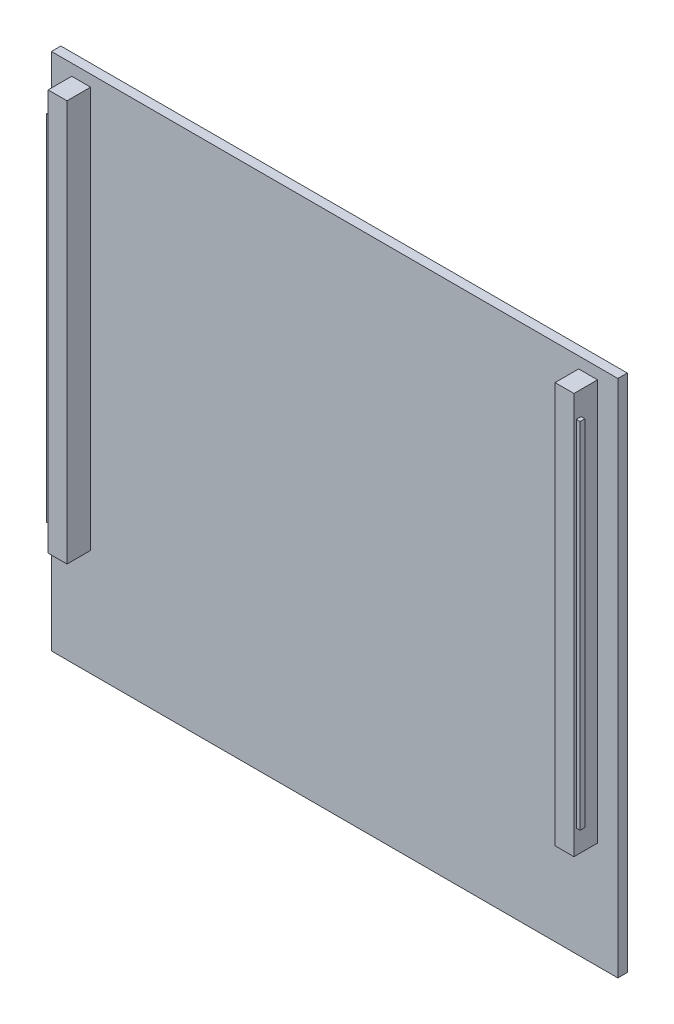
ISO-10303-21;
HEADER;
FILE_DESCRIPTION(('STEP AP214'),'2;1');
FILE_NAME('part.step','',(''),(''),'','','');
FILE_SCHEMA(('AUTOMOTIVE_DESIGN { 1 0 10303 214 1 1 1 1 }'));
ENDSEC;
DATA;
#1=APPLICATION_CONTEXT('core data for automotive mechanical design processes');
#2=APPLICATION_PROTOCOL_DEFINITION('international standard','automotive_design',2000,#1);
#3=PRODUCT_CONTEXT('',#1,'mechanical');
#4=PRODUCT('Part','Part','',(#3));
#5=PRODUCT_RELATED_PRODUCT_CATEGORY('part','',(#4));
#6=PRODUCT_DEFINITION_FORMATION('','',#4);
#7=PRODUCT_DEFINITION_CONTEXT('part definition',#1,'design');
#8=PRODUCT_DEFINITION('design','',#6,#7);
#9=PRODUCT_DEFINITION_SHAPE('','',#8);
#10=(LENGTH_UNIT() NAMED_UNIT(*) SI_UNIT(.MILLI.,.METRE.));
#11=(NAMED_UNIT(*) PLANE_ANGLE_UNIT() SI_UNIT($,.RADIAN.));
#12=(NAMED_UNIT(*) SI_UNIT($,.STERADIAN.) SOLID_ANGLE_UNIT());
#13=UNCERTAINTY_MEASURE_WITH_UNIT(LENGTH_MEASURE(1.E-05),#10,'distance_accuracy_value','');
#14=(GEOMETRIC_REPRESENTATION_CONTEXT(3) GLOBAL_UNCERTAINTY_ASSIGNED_CONTEXT((#13)) GLOBAL_UNIT_ASSIGNED_CONTEXT((#10,
#11,#12)) REPRESENTATION_CONTEXT('',''));
#15=CARTESIAN_POINT('',(0.,0.,0.));
#16=DIRECTION('',(0.,0.,1.));
#17=DIRECTION('',(1.,0.,0.));
#18=AXIS2_PLACEMENT_3D('',#15,#16,#17);
#19=CARTESIAN_POINT('',(-53.3338940566583,53.7305207646671,7.));
#20=DIRECTION('',(1.,0.,0.));
#21=DIRECTION('',(0.,1.,0.));
#22=AXIS2_PLACEMENT_3D('',#19,#20,#21);
#23=PLANE('',#22);
#24=DIRECTION('',(0.,-1.,0.));
#25=VECTOR('',#24,1.);
#26=CARTESIAN_POINT('',(-53.3338940566583,53.7305207646671,2.));
#27=LINE('',#26,#25);
#28=CARTESIAN_POINT('',(-53.3338940566583,53.7305207646671,2.));
#29=VERTEX_POINT('',#28);
#30=CARTESIAN_POINT('',(-53.3338940566583,-31.2694792353329,2.));
#31=VERTEX_POINT('',#30);
#32=EDGE_CURVE('E293',#29,#31,#27,.T.);
#33=ORIENTED_EDGE('',*,*,#32,.T.);
#34=DIRECTION('',(0.,0.,-1.));
#35=VECTOR('',#34,1.);
#36=CARTESIAN_POINT('',(-53.3338940566583,-31.2694792353329,7.));
#37=LINE('',#36,#35);
#38=CARTESIAN_POINT('',(-53.3338940566583,-31.2694792353329,7.));
#39=VERTEX_POINT('',#38);
#40=EDGE_CURVE('E331',#39,#31,#37,.T.);
#41=ORIENTED_EDGE('',*,*,#40,.F.);
#42=DIRECTION('',(0.,-1.,0.));
#43=VECTOR('',#42,1.);
#44=CARTESIAN_POINT('',(-53.3338940566583,53.7305207646671,7.));
#45=LINE('',#44,#43);
#46=CARTESIAN_POINT('',(-53.3338940566583,53.7305207646671,7.));
#47=VERTEX_POINT('',#46);
#48=EDGE_CURVE('E294',#47,#39,#45,.T.);
#49=ORIENTED_EDGE('',*,*,#48,.F.);
#50=DIRECTION('',(0.,0.,-1.));
#51=VECTOR('',#50,1.);
#52=CARTESIAN_POINT('',(-53.3338940566583,53.7305207646671,7.));
#53=LINE('',#52,#51);
#54=EDGE_CURVE('E308',#47,#29,#53,.T.);
#55=ORIENTED_EDGE('',*,*,#54,.T.);
#56=EDGE_LOOP('',(#33,#41,#49,#55));
#57=FACE_BOUND('',#56,.T.);
#58=DIRECTION('',(0.,-1.,0.));
#59=VECTOR('',#58,1.);
#60=CARTESIAN_POINT('',(-53.3338940566583,48.7305207646671,5.5));
#61=LINE('',#60,#59);
#62=CARTESIAN_POINT('',(-53.3338940566583,48.7305207646671,5.5));
#63=VERTEX_POINT('',#62);
#64=CARTESIAN_POINT('',(-53.3338940566583,-26.2694792353329,5.50000000000001));
#65=VERTEX_POINT('',#64);
#66=EDGE_CURVE('E199',#63,#65,#61,.T.);
#67=ORIENTED_EDGE('',*,*,#66,.F.);
#68=DIRECTION('',(0.,0.,-1.));
#69=VECTOR('',#68,1.);
#70=CARTESIAN_POINT('',(-53.3338940566583,48.7305207646671,5.5));
#71=LINE('',#70,#69);
#72=CARTESIAN_POINT('',(-53.3338940566583,48.7305207646671,6.5));
#73=VERTEX_POINT('',#72);
#74=EDGE_CURVE('E196',#73,#63,#71,.T.);
#75=ORIENTED_EDGE('',*,*,#74,.F.);
#76=DIRECTION('',(0.,1.,0.));
#77=VECTOR('',#76,1.);
#78=CARTESIAN_POINT('',(-53.3338940566583,48.7305207646671,6.5));
#79=LINE('',#78,#77);
#80=CARTESIAN_POINT('',(-53.3338940566583,-26.2694792353329,6.50000000000001));
#81=VERTEX_POINT('',#80);
#82=EDGE_CURVE('E60',#81,#73,#79,.T.);
#83=ORIENTED_EDGE('',*,*,#82,.F.);
#84=DIRECTION('',(0.,0.,1.));
#85=VECTOR('',#84,1.);
#86=CARTESIAN_POINT('',(-53.3338940566583,-26.2694792353329,5.50000000000001));
#87=LINE('',#86,#85);
#88=EDGE_CURVE('E55',#65,#81,#87,.T.);
#89=ORIENTED_EDGE('',*,*,#88,.F.);
#90=EDGE_LOOP('',(#67,#75,#83,#89));
#91=FACE_BOUND('',#90,.T.);
#92=ADVANCED_FACE('F39',(#57,#91),#23,.F.);
#93=CARTESIAN_POINT('',(58.0661059433417,53.7305207646671,7.));
#94=DIRECTION('',(-1.,0.,0.));
#95=DIRECTION('',(0.,-1.,0.));
#96=AXIS2_PLACEMENT_3D('',#93,#94,#95);
#97=PLANE('',#96);
#98=DIRECTION('',(0.,1.,0.));
#99=VECTOR('',#98,1.);
#100=CARTESIAN_POINT('',(58.0661059433417,53.7305207646671,2.));
#101=LINE('',#100,#99);
#102=CARTESIAN_POINT('',(58.0661059433417,-31.2694792353329,2.));
#103=VERTEX_POINT('',#102);
#104=CARTESIAN_POINT('',(58.0661059433417,53.7305207646671,2.));
#105=VERTEX_POINT('',#104);
#106=EDGE_CURVE('E252',#103,#105,#101,.T.);
#107=ORIENTED_EDGE('',*,*,#106,.T.);
#108=DIRECTION('',(0.,0.,-1.));
#109=VECTOR('',#108,1.);
#110=CARTESIAN_POINT('',(58.0661059433417,53.7305207646671,7.));
#111=LINE('',#110,#109);
#112=CARTESIAN_POINT('',(58.0661059433417,53.7305207646671,7.));
#113=VERTEX_POINT('',#112);
#114=EDGE_CURVE('E290',#113,#105,#111,.T.);
#115=ORIENTED_EDGE('',*,*,#114,.F.);
#116=DIRECTION('',(0.,1.,0.));
#117=VECTOR('',#116,1.);
#118=CARTESIAN_POINT('',(58.0661059433417,53.7305207646671,7.));
#119=LINE('',#118,#117);
#120=CARTESIAN_POINT('',(58.0661059433417,-31.2694792353329,7.));
#121=VERTEX_POINT('',#120);
#122=EDGE_CURVE('E253',#121,#113,#119,.T.);
#123=ORIENTED_EDGE('',*,*,#122,.F.);
#124=DIRECTION('',(0.,0.,-1.));
#125=VECTOR('',#124,1.);
#126=CARTESIAN_POINT('',(58.0661059433417,-31.2694792353329,7.));
#127=LINE('',#126,#125);
#128=EDGE_CURVE('E267',#121,#103,#127,.T.);
#129=ORIENTED_EDGE('',*,*,#128,.T.);
#130=EDGE_LOOP('',(#107,#115,#123,#129));
#131=FACE_BOUND('',#130,.T.);
#132=DIRECTION('',(0.,-1.,0.));
#133=VECTOR('',#132,1.);
#134=CARTESIAN_POINT('',(58.0661059433417,48.7305207646671,6.5));
#135=LINE('',#134,#133);
#136=CARTESIAN_POINT('',(58.0661059433417,48.7305207646671,6.5));
#137=VERTEX_POINT('',#136);
#138=CARTESIAN_POINT('',(58.0661059433417,-26.2694792353329,6.49999999999999));
#139=VERTEX_POINT('',#138);
#140=EDGE_CURVE('E201',#137,#139,#135,.T.);
#141=ORIENTED_EDGE('',*,*,#140,.F.);
#142=DIRECTION('',(0.,0.,1.));
#143=VECTOR('',#142,1.);
#144=CARTESIAN_POINT('',(58.0661059433417,48.7305207646671,6.5));
#145=LINE('',#144,#143);
#146=CARTESIAN_POINT('',(58.0661059433417,48.7305207646671,5.5));
#147=VERTEX_POINT('',#146);
#148=EDGE_CURVE('E217',#147,#137,#145,.T.);
#149=ORIENTED_EDGE('',*,*,#148,.F.);
#150=DIRECTION('',(0.,1.,0.));
#151=VECTOR('',#150,1.);
#152=CARTESIAN_POINT('',(58.0661059433417,48.7305207646671,5.5));
#153=LINE('',#152,#151);
#154=CARTESIAN_POINT('',(58.0661059433417,-26.2694792353329,5.49999999999999));
#155=VERTEX_POINT('',#154);
#156=EDGE_CURVE('E230',#155,#147,#153,.T.);
#157=ORIENTED_EDGE('',*,*,#156,.F.);
#158=DIRECTION('',(0.,0.,-1.));
#159=VECTOR('',#158,1.);
#160=CARTESIAN_POINT('',(58.0661059433417,-26.2694792353329,6.49999999999999));
#161=LINE('',#160,#159);
#162=EDGE_CURVE('E206',#139,#155,#161,.T.);
#163=ORIENTED_EDGE('',*,*,#162,.F.);
#164=EDGE_LOOP('',(#141,#149,#157,#163));
#165=FACE_BOUND('',#164,.T.);
#166=ADVANCED_FACE('F398',(#131,#165),#97,.F.);
#167=CARTESIAN_POINT('',(0.,0.,2.));
#168=DIRECTION('',(0.,0.,1.));
#169=DIRECTION('',(1.,0.,0.));
#170=AXIS2_PLACEMENT_3D('',#167,#168,#169);
#171=PLANE('',#170);
#172=DIRECTION('',(0.,-1.,0.));
#173=VECTOR('',#172,1.);
#174=CARTESIAN_POINT('',(-57.6338940566583,56.1305207646671,2.));
#175=LINE('',#174,#173);
#176=CARTESIAN_POINT('',(-57.6338940566583,56.1305207646671,2.));
#177=VERTEX_POINT('',#176);
#178=CARTESIAN_POINT('',(-57.6338940566583,-53.8694792353329,2.));
#179=VERTEX_POINT('',#178);
#180=EDGE_CURVE('E335',#177,#179,#175,.T.);
#181=ORIENTED_EDGE('',*,*,#180,.T.);
#182=DIRECTION('',(1.,0.,0.));
#183=VECTOR('',#182,1.);
#184=CARTESIAN_POINT('',(-57.6338940566583,-53.8694792353329,2.));
#185=LINE('',#184,#183);
#186=CARTESIAN_POINT('',(62.3661059433417,-53.8694792353329,2.));
#187=VERTEX_POINT('',#186);
#188=EDGE_CURVE('E339',#179,#187,#185,.T.);
#189=ORIENTED_EDGE('',*,*,#188,.T.);
#190=DIRECTION('',(0.,1.,0.));
#191=VECTOR('',#190,1.);
#192=CARTESIAN_POINT('',(62.3661059433417,56.1305207646671,2.));
#193=LINE('',#192,#191);
#194=CARTESIAN_POINT('',(62.3661059433417,56.1305207646671,2.));
#195=VERTEX_POINT('',#194);
#196=EDGE_CURVE('E343',#187,#195,#193,.T.);
#197=ORIENTED_EDGE('',*,*,#196,.T.);
#198=DIRECTION('',(-1.,0.,0.));
#199=VECTOR('',#198,1.);
#200=CARTESIAN_POINT('',(-57.6338940566583,56.1305207646671,2.));
#201=LINE('',#200,#199);
#202=EDGE_CURVE('E346',#195,#177,#201,.T.);
#203=ORIENTED_EDGE('',*,*,#202,.T.);
#204=EDGE_LOOP('',(#181,#189,#197,#203));
#205=FACE_BOUND('',#204,.T.);
#206=DIRECTION('',(1.,0.,0.));
#207=VECTOR('',#206,1.);
#208=CARTESIAN_POINT('',(-53.3338940566583,-31.2694792353329,2.));
#209=LINE('',#208,#207);
#210=CARTESIAN_POINT('',(-49.3338940566583,-31.2694792353329,2.));
#211=VERTEX_POINT('',#210);
#212=EDGE_CURVE('E312',#31,#211,#209,.T.);
#213=ORIENTED_EDGE('',*,*,#212,.F.);
#214=ORIENTED_EDGE('',*,*,#32,.F.);
#215=DIRECTION('',(-1.,0.,0.));
#216=VECTOR('',#215,1.);
#217=CARTESIAN_POINT('',(-53.3338940566583,53.7305207646671,2.));
#218=LINE('',#217,#216);
#219=CARTESIAN_POINT('',(-49.3338940566583,53.7305207646671,2.));
#220=VERTEX_POINT('',#219);
#221=EDGE_CURVE('E299',#220,#29,#218,.T.);
#222=ORIENTED_EDGE('',*,*,#221,.F.);
#223=DIRECTION('',(0.,1.,0.));
#224=VECTOR('',#223,1.);
#225=CARTESIAN_POINT('',(-49.3338940566583,53.7305207646671,2.));
#226=LINE('',#225,#224);
#227=EDGE_CURVE('E315',#211,#220,#226,.T.);
#228=ORIENTED_EDGE('',*,*,#227,.F.);
#229=EDGE_LOOP('',(#213,#214,#222,#228));
#230=FACE_BOUND('',#229,.T.);
#231=DIRECTION('',(-1.,0.,0.));
#232=VECTOR('',#231,1.);
#233=CARTESIAN_POINT('',(58.0661059433417,53.7305207646671,2.));
#234=LINE('',#233,#232);
#235=CARTESIAN_POINT('',(54.0661059433417,53.7305207646671,2.));
#236=VERTEX_POINT('',#235);
#237=EDGE_CURVE('E271',#105,#236,#234,.T.);
#238=ORIENTED_EDGE('',*,*,#237,.F.);
#239=ORIENTED_EDGE('',*,*,#106,.F.);
#240=DIRECTION('',(1.,0.,0.));
#241=VECTOR('',#240,1.);
#242=CARTESIAN_POINT('',(58.0661059433417,-31.2694792353329,2.));
#243=LINE('',#242,#241);
#244=CARTESIAN_POINT('',(54.0661059433417,-31.2694792353329,2.));
#245=VERTEX_POINT('',#244);
#246=EDGE_CURVE('E258',#245,#103,#243,.T.);
#247=ORIENTED_EDGE('',*,*,#246,.F.);
#248=DIRECTION('',(0.,-1.,0.));
#249=VECTOR('',#248,1.);
#250=CARTESIAN_POINT('',(54.0661059433417,53.7305207646671,2.));
#251=LINE('',#250,#249);
#252=EDGE_CURVE('E274',#236,#245,#251,.T.);
#253=ORIENTED_EDGE('',*,*,#252,.F.);
#254=EDGE_LOOP('',(#238,#239,#247,#253));
#255=FACE_BOUND('',#254,.T.);
#256=ADVANCED_FACE('F388',(#205,#230,#255),#171,.T.);
#257=CARTESIAN_POINT('',(-57.6338940566583,56.1305207646671,2.));
#258=DIRECTION('',(1.,0.,0.));
#259=DIRECTION('',(0.,1.,0.));
#260=AXIS2_PLACEMENT_3D('',#257,#258,#259);
#261=PLANE('',#260);
#262=DIRECTION('',(0.,-1.,0.));
#263=VECTOR('',#262,1.);
#264=CARTESIAN_POINT('',(-57.6338940566583,56.1305207646671,0.));
#265=LINE('',#264,#263);
#266=CARTESIAN_POINT('',(-57.6338940566583,56.1305207646671,0.));
#267=VERTEX_POINT('',#266);
#268=CARTESIAN_POINT('',(-57.6338940566583,-53.8694792353329,0.));
#269=VERTEX_POINT('',#268);
#270=EDGE_CURVE('E334',#267,#269,#265,.T.);
#271=ORIENTED_EDGE('',*,*,#270,.T.);
#272=DIRECTION('',(0.,0.,-1.));
#273=VECTOR('',#272,1.);
#274=CARTESIAN_POINT('',(-57.6338940566583,-53.8694792353329,2.));
#275=LINE('',#274,#273);
#276=EDGE_CURVE('E11',#179,#269,#275,.T.);
#277=ORIENTED_EDGE('',*,*,#276,.F.);
#278=ORIENTED_EDGE('',*,*,#180,.F.);
#279=DIRECTION('',(0.,0.,-1.));
#280=VECTOR('',#279,1.);
#281=CARTESIAN_POINT('',(-57.6338940566583,56.1305207646671,2.));
#282=LINE('',#281,#280);
#283=EDGE_CURVE('E349',#177,#267,#282,.T.);
#284=ORIENTED_EDGE('',*,*,#283,.T.);
#285=EDGE_LOOP('',(#271,#277,#278,#284));
#286=FACE_BOUND('',#285,.T.);
#287=ADVANCED_FACE('F41',(#286),#261,.F.);
#288=CARTESIAN_POINT('',(-57.6338940566583,-53.8694792353329,2.));
#289=DIRECTION('',(0.,1.,0.));
#290=DIRECTION('',(0.,0.,1.));
#291=AXIS2_PLACEMENT_3D('',#288,#289,#290);
#292=PLANE('',#291);
#293=DIRECTION('',(1.,0.,0.));
#294=VECTOR('',#293,1.);
#295=CARTESIAN_POINT('',(-57.6338940566583,-53.8694792353329,0.));
#296=LINE('',#295,#294);
#297=CARTESIAN_POINT('',(62.3661059433417,-53.8694792353329,0.));
#298=VERTEX_POINT('',#297);
#299=EDGE_CURVE('E353',#269,#298,#296,.T.);
#300=ORIENTED_EDGE('',*,*,#299,.T.);
#301=DIRECTION('',(0.,0.,-1.));
#302=VECTOR('',#301,1.);
#303=CARTESIAN_POINT('',(62.3661059433417,-53.8694792353329,2.));
#304=LINE('',#303,#302);
#305=EDGE_CURVE('E48',#187,#298,#304,.T.);
#306=ORIENTED_EDGE('',*,*,#305,.F.);
#307=ORIENTED_EDGE('',*,*,#188,.F.);
#308=ORIENTED_EDGE('',*,*,#276,.T.);
#309=EDGE_LOOP('',(#300,#306,#307,#308));
#310=FACE_BOUND('',#309,.T.);
#311=ADVANCED_FACE('F390',(#310),#292,.F.);
#312=CARTESIAN_POINT('',(62.3661059433417,56.1305207646671,2.));
#313=DIRECTION('',(-1.,0.,0.));
#314=DIRECTION('',(0.,-1.,0.));
#315=AXIS2_PLACEMENT_3D('',#312,#313,#314);
#316=PLANE('',#315);
#317=DIRECTION('',(0.,1.,0.));
#318=VECTOR('',#317,1.);
#319=CARTESIAN_POINT('',(62.3661059433417,56.1305207646671,0.));
#320=LINE('',#319,#318);
#321=CARTESIAN_POINT('',(62.3661059433417,56.1305207646671,0.));
#322=VERTEX_POINT('',#321);
#323=EDGE_CURVE('E356',#298,#322,#320,.T.);
#324=ORIENTED_EDGE('',*,*,#323,.T.);
#325=DIRECTION('',(0.,0.,-1.));
#326=VECTOR('',#325,1.);
#327=CARTESIAN_POINT('',(62.3661059433417,56.1305207646671,2.));
#328=LINE('',#327,#326);
#329=EDGE_CURVE('E364',#195,#322,#328,.T.);
#330=ORIENTED_EDGE('',*,*,#329,.F.);
#331=ORIENTED_EDGE('',*,*,#196,.F.);
#332=ORIENTED_EDGE('',*,*,#305,.T.);
#333=EDGE_LOOP('',(#324,#330,#331,#332));
#334=FACE_BOUND('',#333,.T.);
#335=ADVANCED_FACE('F373',(#334),#316,.F.);
#336=CARTESIAN_POINT('',(-57.6338940566583,56.1305207646671,2.));
#337=DIRECTION('',(0.,-1.,0.));
#338=DIRECTION('',(0.,0.,-1.));
#339=AXIS2_PLACEMENT_3D('',#336,#337,#338);
#340=PLANE('',#339);
#341=DIRECTION('',(-1.,0.,0.));
#342=VECTOR('',#341,1.);
#343=CARTESIAN_POINT('',(-57.6338940566583,56.1305207646671,0.));
#344=LINE('',#343,#342);
#345=EDGE_CURVE('E340',#322,#267,#344,.T.);
#346=ORIENTED_EDGE('',*,*,#345,.T.);
#347=ORIENTED_EDGE('',*,*,#283,.F.);
#348=ORIENTED_EDGE('',*,*,#202,.F.);
#349=ORIENTED_EDGE('',*,*,#329,.T.);
#350=EDGE_LOOP('',(#346,#347,#348,#349));
#351=FACE_BOUND('',#350,.T.);
#352=ADVANCED_FACE('F382',(#351),#340,.F.);
#353=CARTESIAN_POINT('',(0.,0.,0.));
#354=DIRECTION('',(0.,0.,1.));
#355=DIRECTION('',(1.,0.,0.));
#356=AXIS2_PLACEMENT_3D('',#353,#354,#355);
#357=PLANE('',#356);
#358=ORIENTED_EDGE('',*,*,#270,.F.);
#359=ORIENTED_EDGE('',*,*,#345,.F.);
#360=ORIENTED_EDGE('',*,*,#323,.F.);
#361=ORIENTED_EDGE('',*,*,#299,.F.);
#362=EDGE_LOOP('',(#358,#359,#360,#361));
#363=FACE_BOUND('',#362,.T.);
#364=ADVANCED_FACE('F379',(#363),#357,.F.);
#365=CARTESIAN_POINT('',(-53.3338940566583,-31.2694792353329,7.));
#366=DIRECTION('',(0.,1.,0.));
#367=DIRECTION('',(0.,0.,1.));
#368=AXIS2_PLACEMENT_3D('',#365,#366,#367);
#369=PLANE('',#368);
#370=ORIENTED_EDGE('',*,*,#212,.T.);
#371=DIRECTION('',(0.,0.,-1.));
#372=VECTOR('',#371,1.);
#373=CARTESIAN_POINT('',(-49.3338940566583,-31.2694792353329,7.));
#374=LINE('',#373,#372);
#375=CARTESIAN_POINT('',(-49.3338940566583,-31.2694792353329,7.));
#376=VERTEX_POINT('',#375);
#377=EDGE_CURVE('E327',#376,#211,#374,.T.);
#378=ORIENTED_EDGE('',*,*,#377,.F.);
#379=DIRECTION('',(1.,0.,0.));
#380=VECTOR('',#379,1.);
#381=CARTESIAN_POINT('',(-53.3338940566583,-31.2694792353329,7.));
#382=LINE('',#381,#380);
#383=EDGE_CURVE('E298',#39,#376,#382,.T.);
#384=ORIENTED_EDGE('',*,*,#383,.F.);
#385=ORIENTED_EDGE('',*,*,#40,.T.);
#386=EDGE_LOOP('',(#370,#378,#384,#385));
#387=FACE_BOUND('',#386,.T.);
#388=ADVANCED_FACE('F408',(#387),#369,.F.);
#389=CARTESIAN_POINT('',(-49.3338940566583,53.7305207646671,7.));
#390=DIRECTION('',(-1.,0.,0.));
#391=DIRECTION('',(0.,-1.,0.));
#392=AXIS2_PLACEMENT_3D('',#389,#390,#391);
#393=PLANE('',#392);
#394=ORIENTED_EDGE('',*,*,#227,.T.);
#395=DIRECTION('',(0.,0.,-1.));
#396=VECTOR('',#395,1.);
#397=CARTESIAN_POINT('',(-49.3338940566583,53.7305207646671,7.));
#398=LINE('',#397,#396);
#399=CARTESIAN_POINT('',(-49.3338940566583,53.7305207646671,7.));
#400=VERTEX_POINT('',#399);
#401=EDGE_CURVE('E324',#400,#220,#398,.T.);
#402=ORIENTED_EDGE('',*,*,#401,.F.);
#403=DIRECTION('',(0.,1.,0.));
#404=VECTOR('',#403,1.);
#405=CARTESIAN_POINT('',(-49.3338940566583,53.7305207646671,7.));
#406=LINE('',#405,#404);
#407=EDGE_CURVE('E302',#376,#400,#406,.T.);
#408=ORIENTED_EDGE('',*,*,#407,.F.);
#409=ORIENTED_EDGE('',*,*,#377,.T.);
#410=EDGE_LOOP('',(#394,#402,#408,#409));
#411=FACE_BOUND('',#410,.T.);
#412=ADVANCED_FACE('F430',(#411),#393,.F.);
#413=CARTESIAN_POINT('',(-53.3338940566583,53.7305207646671,7.));
#414=DIRECTION('',(0.,-1.,0.));
#415=DIRECTION('',(0.,0.,-1.));
#416=AXIS2_PLACEMENT_3D('',#413,#414,#415);
#417=PLANE('',#416);
#418=ORIENTED_EDGE('',*,*,#221,.T.);
#419=ORIENTED_EDGE('',*,*,#54,.F.);
#420=DIRECTION('',(-1.,0.,0.));
#421=VECTOR('',#420,1.);
#422=CARTESIAN_POINT('',(-53.3338940566583,53.7305207646671,7.));
#423=LINE('',#422,#421);
#424=EDGE_CURVE('E305',#400,#47,#423,.T.);
#425=ORIENTED_EDGE('',*,*,#424,.F.);
#426=ORIENTED_EDGE('',*,*,#401,.T.);
#427=EDGE_LOOP('',(#418,#419,#425,#426));
#428=FACE_BOUND('',#427,.T.);
#429=ADVANCED_FACE('F437',(#428),#417,.F.);
#430=CARTESIAN_POINT('',(0.,0.,7.));
#431=DIRECTION('',(0.,0.,1.));
#432=DIRECTION('',(1.,0.,0.));
#433=AXIS2_PLACEMENT_3D('',#430,#431,#432);
#434=PLANE('',#433);
#435=ORIENTED_EDGE('',*,*,#48,.T.);
#436=ORIENTED_EDGE('',*,*,#383,.T.);
#437=ORIENTED_EDGE('',*,*,#407,.T.);
#438=ORIENTED_EDGE('',*,*,#424,.T.);
#439=EDGE_LOOP('',(#435,#436,#437,#438));
#440=FACE_BOUND('',#439,.T.);
#441=ADVANCED_FACE('F444',(#440),#434,.T.);
#442=CARTESIAN_POINT('',(58.0661059433417,53.7305207646671,7.));
#443=DIRECTION('',(0.,-1.,0.));
#444=DIRECTION('',(0.,0.,-1.));
#445=AXIS2_PLACEMENT_3D('',#442,#443,#444);
#446=PLANE('',#445);
#447=ORIENTED_EDGE('',*,*,#237,.T.);
#448=DIRECTION('',(0.,0.,-1.));
#449=VECTOR('',#448,1.);
#450=CARTESIAN_POINT('',(54.0661059433417,53.7305207646671,7.));
#451=LINE('',#450,#449);
#452=CARTESIAN_POINT('',(54.0661059433417,53.7305207646671,7.));
#453=VERTEX_POINT('',#452);
#454=EDGE_CURVE('E286',#453,#236,#451,.T.);
#455=ORIENTED_EDGE('',*,*,#454,.F.);
#456=DIRECTION('',(-1.,0.,0.));
#457=VECTOR('',#456,1.);
#458=CARTESIAN_POINT('',(58.0661059433417,53.7305207646671,7.));
#459=LINE('',#458,#457);
#460=EDGE_CURVE('E257',#113,#453,#459,.T.);
#461=ORIENTED_EDGE('',*,*,#460,.F.);
#462=ORIENTED_EDGE('',*,*,#114,.T.);
#463=EDGE_LOOP('',(#447,#455,#461,#462));
#464=FACE_BOUND('',#463,.T.);
#465=ADVANCED_FACE('F452',(#464),#446,.F.);
#466=CARTESIAN_POINT('',(54.0661059433417,53.7305207646671,7.));
#467=DIRECTION('',(1.,0.,0.));
#468=DIRECTION('',(0.,1.,0.));
#469=AXIS2_PLACEMENT_3D('',#466,#467,#468);
#470=PLANE('',#469);
#471=ORIENTED_EDGE('',*,*,#252,.T.);
#472=DIRECTION('',(0.,0.,-1.));
#473=VECTOR('',#472,1.);
#474=CARTESIAN_POINT('',(54.0661059433417,-31.2694792353329,7.));
#475=LINE('',#474,#473);
#476=CARTESIAN_POINT('',(54.0661059433417,-31.2694792353329,7.));
#477=VERTEX_POINT('',#476);
#478=EDGE_CURVE('E283',#477,#245,#475,.T.);
#479=ORIENTED_EDGE('',*,*,#478,.F.);
#480=DIRECTION('',(0.,-1.,0.));
#481=VECTOR('',#480,1.);
#482=CARTESIAN_POINT('',(54.0661059433417,53.7305207646671,7.));
#483=LINE('',#482,#481);
#484=EDGE_CURVE('E261',#453,#477,#483,.T.);
#485=ORIENTED_EDGE('',*,*,#484,.F.);
#486=ORIENTED_EDGE('',*,*,#454,.T.);
#487=EDGE_LOOP('',(#471,#479,#485,#486));
#488=FACE_BOUND('',#487,.T.);
#489=ADVANCED_FACE('F460',(#488),#470,.F.);
#490=CARTESIAN_POINT('',(58.0661059433417,-31.2694792353329,7.));
#491=DIRECTION('',(0.,1.,0.));
#492=DIRECTION('',(0.,0.,1.));
#493=AXIS2_PLACEMENT_3D('',#490,#491,#492);
#494=PLANE('',#493);
#495=ORIENTED_EDGE('',*,*,#246,.T.);
#496=ORIENTED_EDGE('',*,*,#128,.F.);
#497=DIRECTION('',(1.,0.,0.));
#498=VECTOR('',#497,1.);
#499=CARTESIAN_POINT('',(58.0661059433417,-31.2694792353329,7.));
#500=LINE('',#499,#498);
#501=EDGE_CURVE('E264',#477,#121,#500,.T.);
#502=ORIENTED_EDGE('',*,*,#501,.F.);
#503=ORIENTED_EDGE('',*,*,#478,.T.);
#504=EDGE_LOOP('',(#495,#496,#502,#503));
#505=FACE_BOUND('',#504,.T.);
#506=ADVANCED_FACE('F468',(#505),#494,.F.);
#507=CARTESIAN_POINT('',(0.,0.,7.));
#508=DIRECTION('',(0.,0.,-1.));
#509=DIRECTION('',(-1.,0.,0.));
#510=AXIS2_PLACEMENT_3D('',#507,#508,#509);
#511=PLANE('',#510);
#512=ORIENTED_EDGE('',*,*,#122,.T.);
#513=ORIENTED_EDGE('',*,*,#460,.T.);
#514=ORIENTED_EDGE('',*,*,#484,.T.);
#515=ORIENTED_EDGE('',*,*,#501,.T.);
#516=EDGE_LOOP('',(#512,#513,#514,#515));
#517=FACE_BOUND('',#516,.T.);
#518=ADVANCED_FACE('F476',(#517),#511,.F.);
#519=CARTESIAN_POINT('',(58.8661059433417,48.7305207646671,6.5));
#520=DIRECTION('',(0.,0.,-1.));
#521=DIRECTION('',(0.,1.,0.));
#522=AXIS2_PLACEMENT_3D('',#519,#520,#521);
#523=PLANE('',#522);
#524=ORIENTED_EDGE('',*,*,#140,.T.);
#525=DIRECTION('',(-1.,0.,0.));
#526=VECTOR('',#525,1.);
#527=CARTESIAN_POINT('',(58.8661059433417,-26.2694792353329,6.49999999999999));
#528=LINE('',#527,#526);
#529=CARTESIAN_POINT('',(58.8661059433417,-26.2694792353329,6.49999999999999));
#530=VERTEX_POINT('',#529);
#531=EDGE_CURVE('E248',#530,#139,#528,.T.);
#532=ORIENTED_EDGE('',*,*,#531,.F.);
#533=DIRECTION('',(0.,-1.,0.));
#534=VECTOR('',#533,1.);
#535=CARTESIAN_POINT('',(58.8661059433417,48.7305207646671,6.5));
#536=LINE('',#535,#534);
#537=CARTESIAN_POINT('',(58.8661059433417,48.7305207646671,6.5));
#538=VERTEX_POINT('',#537);
#539=EDGE_CURVE('E212',#538,#530,#536,.T.);
#540=ORIENTED_EDGE('',*,*,#539,.F.);
#541=DIRECTION('',(-1.,0.,0.));
#542=VECTOR('',#541,1.);
#543=CARTESIAN_POINT('',(58.8661059433417,48.7305207646671,6.5));
#544=LINE('',#543,#542);
#545=EDGE_CURVE('E225',#538,#137,#544,.T.);
#546=ORIENTED_EDGE('',*,*,#545,.T.);
#547=EDGE_LOOP('',(#524,#532,#540,#546));
#548=FACE_BOUND('',#547,.T.);
#549=ADVANCED_FACE('F484',(#548),#523,.F.);
#550=CARTESIAN_POINT('',(58.8661059433417,-26.2694792353329,6.49999999999999));
#551=DIRECTION('',(0.,1.,0.));
#552=DIRECTION('',(-1.,0.,0.));
#553=AXIS2_PLACEMENT_3D('',#550,#551,#552);
#554=PLANE('',#553);
#555=ORIENTED_EDGE('',*,*,#162,.T.);
#556=DIRECTION('',(-1.,0.,0.));
#557=VECTOR('',#556,1.);
#558=CARTESIAN_POINT('',(58.8661059433417,-26.2694792353329,5.49999999999999));
#559=LINE('',#558,#557);
#560=CARTESIAN_POINT('',(58.8661059433417,-26.2694792353329,5.49999999999999));
#561=VERTEX_POINT('',#560);
#562=EDGE_CURVE('E244',#561,#155,#559,.T.);
#563=ORIENTED_EDGE('',*,*,#562,.F.);
#564=DIRECTION('',(0.,0.,-1.));
#565=VECTOR('',#564,1.);
#566=CARTESIAN_POINT('',(58.8661059433417,-26.2694792353329,6.49999999999999));
#567=LINE('',#566,#565);
#568=EDGE_CURVE('E216',#530,#561,#567,.T.);
#569=ORIENTED_EDGE('',*,*,#568,.F.);
#570=ORIENTED_EDGE('',*,*,#531,.T.);
#571=EDGE_LOOP('',(#555,#563,#569,#570));
#572=FACE_BOUND('',#571,.T.);
#573=ADVANCED_FACE('F493',(#572),#554,.F.);
#574=CARTESIAN_POINT('',(58.8661059433417,48.7305207646671,5.5));
#575=DIRECTION('',(0.,0.,1.));
#576=DIRECTION('',(0.,-1.,0.));
#577=AXIS2_PLACEMENT_3D('',#574,#575,#576);
#578=PLANE('',#577);
#579=ORIENTED_EDGE('',*,*,#156,.T.);
#580=DIRECTION('',(-1.,0.,0.));
#581=VECTOR('',#580,1.);
#582=CARTESIAN_POINT('',(58.8661059433417,48.7305207646671,5.5));
#583=LINE('',#582,#581);
#584=CARTESIAN_POINT('',(58.8661059433417,48.7305207646671,5.5));
#585=VERTEX_POINT('',#584);
#586=EDGE_CURVE('E240',#585,#147,#583,.T.);
#587=ORIENTED_EDGE('',*,*,#586,.F.);
#588=DIRECTION('',(0.,1.,0.));
#589=VECTOR('',#588,1.);
#590=CARTESIAN_POINT('',(58.8661059433417,48.7305207646671,5.5));
#591=LINE('',#590,#589);
#592=EDGE_CURVE('E220',#561,#585,#591,.T.);
#593=ORIENTED_EDGE('',*,*,#592,.F.);
#594=ORIENTED_EDGE('',*,*,#562,.T.);
#595=EDGE_LOOP('',(#579,#587,#593,#594));
#596=FACE_BOUND('',#595,.T.);
#597=ADVANCED_FACE('F501',(#596),#578,.F.);
#598=CARTESIAN_POINT('',(58.8661059433417,48.7305207646671,6.5));
#599=DIRECTION('',(0.,-1.,0.));
#600=DIRECTION('',(1.,0.,0.));
#601=AXIS2_PLACEMENT_3D('',#598,#599,#600);
#602=PLANE('',#601);
#603=ORIENTED_EDGE('',*,*,#148,.T.);
#604=ORIENTED_EDGE('',*,*,#545,.F.);
#605=DIRECTION('',(0.,0.,1.));
#606=VECTOR('',#605,1.);
#607=CARTESIAN_POINT('',(58.8661059433417,48.7305207646671,6.5));
#608=LINE('',#607,#606);
#609=EDGE_CURVE('E223',#585,#538,#608,.T.);
#610=ORIENTED_EDGE('',*,*,#609,.F.);
#611=ORIENTED_EDGE('',*,*,#586,.T.);
#612=EDGE_LOOP('',(#603,#604,#610,#611));
#613=FACE_BOUND('',#612,.T.);
#614=ADVANCED_FACE('F509',(#613),#602,.F.);
#615=CARTESIAN_POINT('',(58.8661059433417,0.,0.));
#616=DIRECTION('',(1.,0.,0.));
#617=DIRECTION('',(0.,1.,0.));
#618=AXIS2_PLACEMENT_3D('',#615,#616,#617);
#619=PLANE('',#618);
#620=ORIENTED_EDGE('',*,*,#539,.T.);
#621=ORIENTED_EDGE('',*,*,#568,.T.);
#622=ORIENTED_EDGE('',*,*,#592,.T.);
#623=ORIENTED_EDGE('',*,*,#609,.T.);
#624=EDGE_LOOP('',(#620,#621,#622,#623));
#625=FACE_BOUND('',#624,.T.);
#626=ADVANCED_FACE('F517',(#625),#619,.T.);
#627=CARTESIAN_POINT('',(-54.1338940566583,48.7305207646671,5.5));
#628=DIRECTION('',(0.,0.,1.));
#629=DIRECTION('',(0.,-1.,0.));
#630=AXIS2_PLACEMENT_3D('',#627,#628,#629);
#631=PLANE('',#630);
#632=ORIENTED_EDGE('',*,*,#66,.T.);
#633=DIRECTION('',(1.,0.,0.));
#634=VECTOR('',#633,1.);
#635=CARTESIAN_POINT('',(-54.1338940566583,-26.2694792353329,5.50000000000001));
#636=LINE('',#635,#634);
#637=CARTESIAN_POINT('',(-54.1338940566583,-26.2694792353329,5.50000000000001));
#638=VERTEX_POINT('',#637);
#639=EDGE_CURVE('E178',#638,#65,#636,.T.);
#640=ORIENTED_EDGE('',*,*,#639,.F.);
#641=DIRECTION('',(0.,-1.,0.));
#642=VECTOR('',#641,1.);
#643=CARTESIAN_POINT('',(-54.1338940566583,48.7305207646671,5.5));
#644=LINE('',#643,#642);
#645=CARTESIAN_POINT('',(-54.1338940566583,48.7305207646671,5.5));
#646=VERTEX_POINT('',#645);
#647=EDGE_CURVE('E186',#646,#638,#644,.T.);
#648=ORIENTED_EDGE('',*,*,#647,.F.);
#649=DIRECTION('',(1.,0.,0.));
#650=VECTOR('',#649,1.);
#651=CARTESIAN_POINT('',(-54.1338940566583,48.7305207646671,5.5));
#652=LINE('',#651,#650);
#653=EDGE_CURVE('E632',#646,#63,#652,.T.);
#654=ORIENTED_EDGE('',*,*,#653,.T.);
#655=EDGE_LOOP('',(#632,#640,#648,#654));
#656=FACE_BOUND('',#655,.T.);
#657=ADVANCED_FACE('F198',(#656),#631,.F.);
#658=CARTESIAN_POINT('',(-54.1338940566583,-26.2694792353329,5.50000000000001));
#659=DIRECTION('',(0.,1.,0.));
#660=DIRECTION('',(-1.,0.,0.));
#661=AXIS2_PLACEMENT_3D('',#658,#659,#660);
#662=PLANE('',#661);
#663=ORIENTED_EDGE('',*,*,#88,.T.);
#664=DIRECTION('',(1.,0.,0.));
#665=VECTOR('',#664,1.);
#666=CARTESIAN_POINT('',(-54.1338940566583,-26.2694792353329,6.50000000000001));
#667=LINE('',#666,#665);
#668=CARTESIAN_POINT('',(-54.1338940566583,-26.2694792353329,6.50000000000001));
#669=VERTEX_POINT('',#668);
#670=EDGE_CURVE('E181',#669,#81,#667,.T.);
#671=ORIENTED_EDGE('',*,*,#670,.F.);
#672=DIRECTION('',(0.,0.,1.));
#673=VECTOR('',#672,1.);
#674=CARTESIAN_POINT('',(-54.1338940566583,-26.2694792353329,5.50000000000001));
#675=LINE('',#674,#673);
#676=EDGE_CURVE('E174',#638,#669,#675,.T.);
#677=ORIENTED_EDGE('',*,*,#676,.F.);
#678=ORIENTED_EDGE('',*,*,#639,.T.);
#679=EDGE_LOOP('',(#663,#671,#677,#678));
#680=FACE_BOUND('',#679,.T.);
#681=ADVANCED_FACE('F176',(#680),#662,.F.);
#682=CARTESIAN_POINT('',(-54.1338940566583,48.7305207646671,6.5));
#683=DIRECTION('',(0.,0.,-1.));
#684=DIRECTION('',(0.,1.,0.));
#685=AXIS2_PLACEMENT_3D('',#682,#683,#684);
#686=PLANE('',#685);
#687=ORIENTED_EDGE('',*,*,#82,.T.);
#688=DIRECTION('',(1.,0.,0.));
#689=VECTOR('',#688,1.);
#690=CARTESIAN_POINT('',(-54.1338940566583,48.7305207646671,6.5));
#691=LINE('',#690,#689);
#692=CARTESIAN_POINT('',(-54.1338940566583,48.7305207646671,6.5));
#693=VERTEX_POINT('',#692);
#694=EDGE_CURVE('E208',#693,#73,#691,.T.);
#695=ORIENTED_EDGE('',*,*,#694,.F.);
#696=DIRECTION('',(0.,1.,0.));
#697=VECTOR('',#696,1.);
#698=CARTESIAN_POINT('',(-54.1338940566583,48.7305207646671,6.5));
#699=LINE('',#698,#697);
#700=EDGE_CURVE('E185',#669,#693,#699,.T.);
#701=ORIENTED_EDGE('',*,*,#700,.F.);
#702=ORIENTED_EDGE('',*,*,#670,.T.);
#703=EDGE_LOOP('',(#687,#695,#701,#702));
#704=FACE_BOUND('',#703,.T.);
#705=ADVANCED_FACE('F538',(#704),#686,.F.);
#706=CARTESIAN_POINT('',(-54.1338940566583,48.7305207646671,5.5));
#707=DIRECTION('',(0.,-1.,0.));
#708=DIRECTION('',(1.,0.,0.));
#709=AXIS2_PLACEMENT_3D('',#706,#707,#708);
#710=PLANE('',#709);
#711=ORIENTED_EDGE('',*,*,#74,.T.);
#712=ORIENTED_EDGE('',*,*,#653,.F.);
#713=DIRECTION('',(0.,0.,-1.));
#714=VECTOR('',#713,1.);
#715=CARTESIAN_POINT('',(-54.1338940566583,48.7305207646671,5.5));
#716=LINE('',#715,#714);
#717=EDGE_CURVE('E191',#693,#646,#716,.T.);
#718=ORIENTED_EDGE('',*,*,#717,.F.);
#719=ORIENTED_EDGE('',*,*,#694,.T.);
#720=EDGE_LOOP('',(#711,#712,#718,#719));
#721=FACE_BOUND('',#720,.T.);
#722=ADVANCED_FACE('F545',(#721),#710,.F.);
#723=CARTESIAN_POINT('',(-54.1338940566583,0.,0.));
#724=DIRECTION('',(-1.,0.,0.));
#725=DIRECTION('',(0.,-1.,0.));
#726=AXIS2_PLACEMENT_3D('',#723,#724,#725);
#727=PLANE('',#726);
#728=ORIENTED_EDGE('',*,*,#647,.T.);
#729=ORIENTED_EDGE('',*,*,#676,.T.);
#730=ORIENTED_EDGE('',*,*,#700,.T.);
#731=ORIENTED_EDGE('',*,*,#717,.T.);
#732=EDGE_LOOP('',(#728,#729,#730,#731));
#733=FACE_BOUND('',#732,.T.);
#734=ADVANCED_FACE('F189',(#733),#727,.T.);
#735=CLOSED_SHELL('',(#92,#166,#256,#287,#311,#335,#352,#364,#388,#412,#429,#441,#465,#489,#506,
#518,#549,#573,#597,#614,#626,#657,#681,#705,#722,#734));
#736=MANIFOLD_SOLID_BREP('B2',#735);
#737=ADVANCED_BREP_SHAPE_REPRESENTATION('',(#18,#736),#14);
#738=SHAPE_DEFINITION_REPRESENTATION(#9,#737);
ENDSEC;
END-ISO-10303-21;
